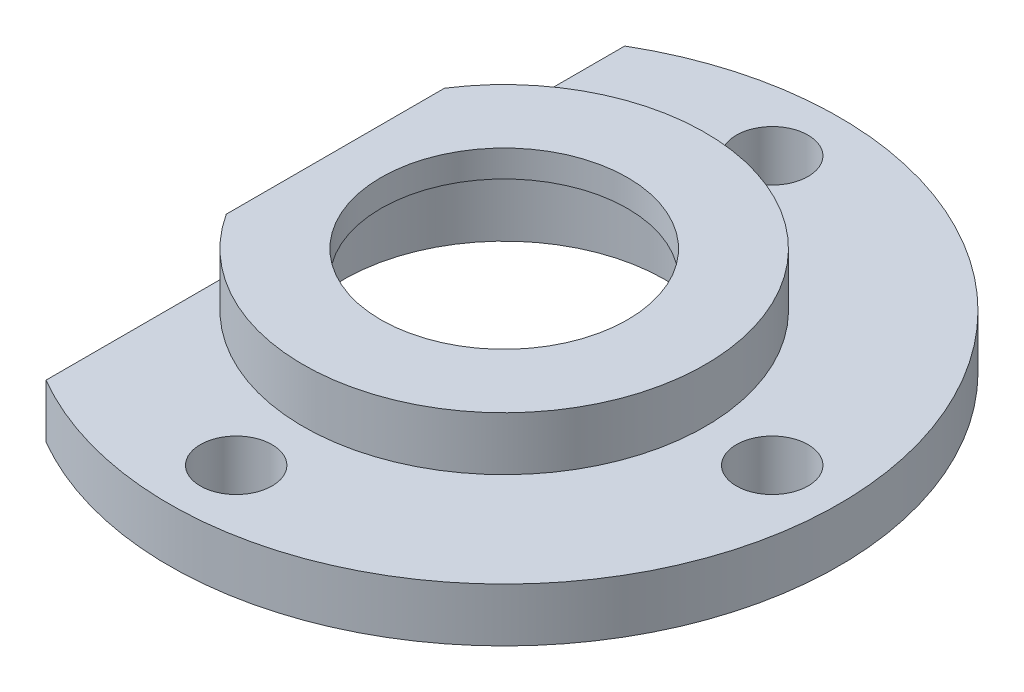
ISO-10303-21;
HEADER;
FILE_DESCRIPTION(('STEP AP214'),'2;1');
FILE_NAME('part.step','',(''),(''),'','','');
FILE_SCHEMA(('AUTOMOTIVE_DESIGN { 1 0 10303 214 1 1 1 1 }'));
ENDSEC;
DATA;
#1=APPLICATION_CONTEXT('core data for automotive mechanical design processes');
#2=APPLICATION_PROTOCOL_DEFINITION('international standard','automotive_design',2000,#1);
#3=PRODUCT_CONTEXT('',#1,'mechanical');
#4=PRODUCT('Part','Part','',(#3));
#5=PRODUCT_RELATED_PRODUCT_CATEGORY('part','',(#4));
#6=PRODUCT_DEFINITION_FORMATION('','',#4);
#7=PRODUCT_DEFINITION_CONTEXT('part definition',#1,'design');
#8=PRODUCT_DEFINITION('design','',#6,#7);
#9=PRODUCT_DEFINITION_SHAPE('','',#8);
#10=(LENGTH_UNIT() NAMED_UNIT(*) SI_UNIT(.MILLI.,.METRE.));
#11=(NAMED_UNIT(*) PLANE_ANGLE_UNIT() SI_UNIT($,.RADIAN.));
#12=(NAMED_UNIT(*) SI_UNIT($,.STERADIAN.) SOLID_ANGLE_UNIT());
#13=UNCERTAINTY_MEASURE_WITH_UNIT(LENGTH_MEASURE(1.E-05),#10,'distance_accuracy_value','');
#14=(GEOMETRIC_REPRESENTATION_CONTEXT(3) GLOBAL_UNCERTAINTY_ASSIGNED_CONTEXT((#13)) GLOBAL_UNIT_ASSIGNED_CONTEXT((#10,
#11,#12)) REPRESENTATION_CONTEXT('',''));
#15=CARTESIAN_POINT('',(0.,0.,0.));
#16=DIRECTION('',(0.,0.,1.));
#17=DIRECTION('',(1.,0.,0.));
#18=AXIS2_PLACEMENT_3D('',#15,#16,#17);
#19=CARTESIAN_POINT('',(0.,2.54,0.));
#20=DIRECTION('',(0.,-1.,0.));
#21=DIRECTION('',(0.,0.,-1.));
#22=AXIS2_PLACEMENT_3D('',#19,#20,#21);
#23=CYLINDRICAL_SURFACE('',#22,15.875);
#24=DIRECTION('',(0.,-1.,0.));
#25=VECTOR('',#24,1.);
#26=CARTESIAN_POINT('',(-8.,5.33400000000001,-13.7118789740867));
#27=LINE('',#26,#25);
#28=CARTESIAN_POINT('',(-8.,2.54,-13.7118789740867));
#29=VERTEX_POINT('',#28);
#30=CARTESIAN_POINT('',(-8.,0.,-13.7118789740867));
#31=VERTEX_POINT('',#30);
#32=EDGE_CURVE('E80',#29,#31,#27,.T.);
#33=ORIENTED_EDGE('',*,*,#32,.F.);
#34=CARTESIAN_POINT('',(0.,2.54,0.));
#35=DIRECTION('',(0.,1.,0.));
#36=DIRECTION('',(0.,0.,1.));
#37=AXIS2_PLACEMENT_3D('',#34,#35,#36);
#38=CIRCLE('',#37,15.875);
#39=CARTESIAN_POINT('',(-8.,2.54,13.7118789740867));
#40=VERTEX_POINT('',#39);
#41=EDGE_CURVE('E100',#40,#29,#38,.T.);
#42=ORIENTED_EDGE('',*,*,#41,.F.);
#43=DIRECTION('',(0.,-1.,0.));
#44=VECTOR('',#43,1.);
#45=CARTESIAN_POINT('',(-8.,5.33400000000001,13.7118789740867));
#46=LINE('',#45,#44);
#47=CARTESIAN_POINT('',(-8.,0.,13.7118789740867));
#48=VERTEX_POINT('',#47);
#49=EDGE_CURVE('E91',#40,#48,#46,.T.);
#50=ORIENTED_EDGE('',*,*,#49,.T.);
#51=CARTESIAN_POINT('',(0.,0.,0.));
#52=DIRECTION('',(0.,1.,0.));
#53=DIRECTION('',(0.,0.,1.));
#54=AXIS2_PLACEMENT_3D('',#51,#52,#53);
#55=CIRCLE('',#54,15.875);
#56=EDGE_CURVE('E96',#48,#31,#55,.T.);
#57=ORIENTED_EDGE('',*,*,#56,.T.);
#58=EDGE_LOOP('',(#33,#42,#50,#57));
#59=FACE_BOUND('',#58,.T.);
#60=ADVANCED_FACE('F43',(#59),#23,.T.);
#61=CARTESIAN_POINT('',(0.,2.54,0.));
#62=DIRECTION('',(0.,1.,0.));
#63=DIRECTION('',(0.,0.,1.));
#64=AXIS2_PLACEMENT_3D('',#61,#62,#63);
#65=PLANE('',#64);
#66=CARTESIAN_POINT('',(0.,2.54,12.7));
#67=DIRECTION('',(0.,1.,0.));
#68=DIRECTION('',(0.,0.,1.));
#69=AXIS2_PLACEMENT_3D('',#66,#67,#68);
#70=CIRCLE('',#69,1.7);
#71=CARTESIAN_POINT('',(0.,2.54,14.4));
#72=VERTEX_POINT('',#71);
#73=EDGE_CURVE('E128',#72,#72,#70,.T.);
#74=ORIENTED_EDGE('',*,*,#73,.F.);
#75=EDGE_LOOP('',(#74));
#76=FACE_BOUND('',#75,.T.);
#77=CARTESIAN_POINT('',(12.7,2.54,0.));
#78=DIRECTION('',(0.,1.,0.));
#79=DIRECTION('',(0.,0.,1.));
#80=AXIS2_PLACEMENT_3D('',#77,#78,#79);
#81=CIRCLE('',#80,1.70000000000004);
#82=CARTESIAN_POINT('',(12.7,2.54,1.70000000000004));
#83=VERTEX_POINT('',#82);
#84=EDGE_CURVE('E137',#83,#83,#81,.T.);
#85=ORIENTED_EDGE('',*,*,#84,.F.);
#86=EDGE_LOOP('',(#85));
#87=FACE_BOUND('',#86,.T.);
#88=CARTESIAN_POINT('',(0.,2.54,-12.7));
#89=DIRECTION('',(0.,1.,0.));
#90=DIRECTION('',(0.,0.,1.));
#91=AXIS2_PLACEMENT_3D('',#88,#89,#90);
#92=CIRCLE('',#91,1.7);
#93=CARTESIAN_POINT('',(0.,2.54,-11.));
#94=VERTEX_POINT('',#93);
#95=EDGE_CURVE('E141',#94,#94,#92,.T.);
#96=ORIENTED_EDGE('',*,*,#95,.F.);
#97=EDGE_LOOP('',(#96));
#98=FACE_BOUND('',#97,.T.);
#99=ORIENTED_EDGE('',*,*,#41,.T.);
#100=DIRECTION('',(0.,0.,1.));
#101=VECTOR('',#100,1.);
#102=CARTESIAN_POINT('',(-8.,2.54,0.));
#103=LINE('',#102,#101);
#104=CARTESIAN_POINT('',(-8.,2.54,-5.16968325915621));
#105=VERTEX_POINT('',#104);
#106=EDGE_CURVE('E85',#29,#105,#103,.T.);
#107=ORIENTED_EDGE('',*,*,#106,.T.);
#108=CARTESIAN_POINT('',(0.,2.54,0.));
#109=DIRECTION('',(0.,1.,0.));
#110=DIRECTION('',(0.,0.,1.));
#111=AXIS2_PLACEMENT_3D('',#108,#109,#110);
#112=CIRCLE('',#111,9.525);
#113=CARTESIAN_POINT('',(-8.,2.54,5.16968325915621));
#114=VERTEX_POINT('',#113);
#115=EDGE_CURVE('E51',#114,#105,#112,.T.);
#116=ORIENTED_EDGE('',*,*,#115,.F.);
#117=EDGE_CURVE('E151',#114,#40,#103,.T.);
#118=ORIENTED_EDGE('',*,*,#117,.T.);
#119=EDGE_LOOP('',(#99,#107,#116,#118));
#120=FACE_BOUND('',#119,.T.);
#121=ADVANCED_FACE('F163',(#76,#87,#98,#120),#65,.T.);
#122=CARTESIAN_POINT('',(0.,0.,0.));
#123=DIRECTION('',(0.,1.,0.));
#124=DIRECTION('',(0.,0.,1.));
#125=AXIS2_PLACEMENT_3D('',#122,#123,#124);
#126=PLANE('',#125);
#127=CARTESIAN_POINT('',(0.,0.,0.));
#128=DIRECTION('',(0.,-1.,0.));
#129=DIRECTION('',(0.,0.,-1.));
#130=AXIS2_PLACEMENT_3D('',#127,#128,#129);
#131=CIRCLE('',#130,7.62);
#132=CARTESIAN_POINT('',(0.,0.,-7.62));
#133=VERTEX_POINT('',#132);
#134=EDGE_CURVE('E112',#133,#133,#131,.T.);
#135=ORIENTED_EDGE('',*,*,#134,.F.);
#136=EDGE_LOOP('',(#135));
#137=FACE_BOUND('',#136,.T.);
#138=CARTESIAN_POINT('',(0.,0.,12.7));
#139=DIRECTION('',(0.,1.,0.));
#140=DIRECTION('',(0.,0.,1.));
#141=AXIS2_PLACEMENT_3D('',#138,#139,#140);
#142=CIRCLE('',#141,1.7);
#143=CARTESIAN_POINT('',(0.,0.,14.4));
#144=VERTEX_POINT('',#143);
#145=EDGE_CURVE('E133',#144,#144,#142,.F.);
#146=ORIENTED_EDGE('',*,*,#145,.F.);
#147=EDGE_LOOP('',(#146));
#148=FACE_BOUND('',#147,.T.);
#149=CARTESIAN_POINT('',(12.7,0.,0.));
#150=DIRECTION('',(0.,1.,0.));
#151=DIRECTION('',(0.,0.,1.));
#152=AXIS2_PLACEMENT_3D('',#149,#150,#151);
#153=CIRCLE('',#152,1.70000000000004);
#154=CARTESIAN_POINT('',(12.7,0.,1.70000000000004));
#155=VERTEX_POINT('',#154);
#156=EDGE_CURVE('E132',#155,#155,#153,.F.);
#157=ORIENTED_EDGE('',*,*,#156,.F.);
#158=EDGE_LOOP('',(#157));
#159=FACE_BOUND('',#158,.T.);
#160=CARTESIAN_POINT('',(0.,0.,-12.7));
#161=DIRECTION('',(0.,1.,0.));
#162=DIRECTION('',(0.,0.,1.));
#163=AXIS2_PLACEMENT_3D('',#160,#161,#162);
#164=CIRCLE('',#163,1.7);
#165=CARTESIAN_POINT('',(0.,0.,-11.));
#166=VERTEX_POINT('',#165);
#167=EDGE_CURVE('E124',#166,#166,#164,.F.);
#168=ORIENTED_EDGE('',*,*,#167,.F.);
#169=EDGE_LOOP('',(#168));
#170=FACE_BOUND('',#169,.T.);
#171=DIRECTION('',(0.,0.,1.));
#172=VECTOR('',#171,1.);
#173=CARTESIAN_POINT('',(-8.,0.,0.));
#174=LINE('',#173,#172);
#175=EDGE_CURVE('E83',#31,#48,#174,.T.);
#176=ORIENTED_EDGE('',*,*,#175,.F.);
#177=ORIENTED_EDGE('',*,*,#56,.F.);
#178=EDGE_LOOP('',(#176,#177));
#179=FACE_BOUND('',#178,.T.);
#180=ADVANCED_FACE('F95',(#137,#148,#159,#170,#179),#126,.F.);
#181=CARTESIAN_POINT('',(0.,5.08,0.));
#182=DIRECTION('',(0.,-1.,0.));
#183=DIRECTION('',(0.,0.,-1.));
#184=AXIS2_PLACEMENT_3D('',#181,#182,#183);
#185=CYLINDRICAL_SURFACE('',#184,9.525);
#186=DIRECTION('',(0.,-1.,0.));
#187=VECTOR('',#186,1.);
#188=CARTESIAN_POINT('',(-8.,5.08,-5.16968325915621));
#189=LINE('',#188,#187);
#190=CARTESIAN_POINT('',(-8.,5.08,-5.16968325915621));
#191=VERTEX_POINT('',#190);
#192=EDGE_CURVE('E63',#191,#105,#189,.T.);
#193=ORIENTED_EDGE('',*,*,#192,.F.);
#194=CARTESIAN_POINT('',(0.,5.08,0.));
#195=DIRECTION('',(0.,1.,0.));
#196=DIRECTION('',(0.,0.,1.));
#197=AXIS2_PLACEMENT_3D('',#194,#195,#196);
#198=CIRCLE('',#197,9.525);
#199=CARTESIAN_POINT('',(-8.,5.08,5.16968325915621));
#200=VERTEX_POINT('',#199);
#201=EDGE_CURVE('E101',#200,#191,#198,.T.);
#202=ORIENTED_EDGE('',*,*,#201,.F.);
#203=DIRECTION('',(0.,-1.,0.));
#204=VECTOR('',#203,1.);
#205=CARTESIAN_POINT('',(-8.,5.08,5.16968325915621));
#206=LINE('',#205,#204);
#207=EDGE_CURVE('E58',#114,#200,#206,.F.);
#208=ORIENTED_EDGE('',*,*,#207,.F.);
#209=ORIENTED_EDGE('',*,*,#115,.T.);
#210=EDGE_LOOP('',(#193,#202,#208,#209));
#211=FACE_BOUND('',#210,.T.);
#212=ADVANCED_FACE('F165',(#211),#185,.T.);
#213=CARTESIAN_POINT('',(0.,5.08,0.));
#214=DIRECTION('',(0.,1.,0.));
#215=DIRECTION('',(0.,0.,1.));
#216=AXIS2_PLACEMENT_3D('',#213,#214,#215);
#217=PLANE('',#216);
#218=CARTESIAN_POINT('',(0.,5.08,0.));
#219=DIRECTION('',(0.,1.,0.));
#220=DIRECTION('',(0.,0.,1.));
#221=AXIS2_PLACEMENT_3D('',#218,#219,#220);
#222=CIRCLE('',#221,5.842);
#223=CARTESIAN_POINT('',(0.,5.08,5.842));
#224=VERTEX_POINT('',#223);
#225=EDGE_CURVE('E116',#224,#224,#222,.T.);
#226=ORIENTED_EDGE('',*,*,#225,.F.);
#227=EDGE_LOOP('',(#226));
#228=FACE_BOUND('',#227,.T.);
#229=ORIENTED_EDGE('',*,*,#201,.T.);
#230=DIRECTION('',(0.,0.,1.));
#231=VECTOR('',#230,1.);
#232=CARTESIAN_POINT('',(-8.,5.08,0.));
#233=LINE('',#232,#231);
#234=EDGE_CURVE('E11',#191,#200,#233,.T.);
#235=ORIENTED_EDGE('',*,*,#234,.T.);
#236=EDGE_LOOP('',(#229,#235));
#237=FACE_BOUND('',#236,.T.);
#238=ADVANCED_FACE('F168',(#228,#237),#217,.T.);
#239=CARTESIAN_POINT('',(0.,3.81,0.));
#240=DIRECTION('',(0.,-1.,0.));
#241=DIRECTION('',(0.,0.,-1.));
#242=AXIS2_PLACEMENT_3D('',#239,#240,#241);
#243=CYLINDRICAL_SURFACE('',#242,7.62);
#244=CARTESIAN_POINT('',(0.,3.81,0.));
#245=DIRECTION('',(0.,-1.,0.));
#246=DIRECTION('',(0.,0.,-1.));
#247=AXIS2_PLACEMENT_3D('',#244,#245,#246);
#248=CIRCLE('',#247,7.62);
#249=CARTESIAN_POINT('',(0.,3.81,-7.62));
#250=VERTEX_POINT('',#249);
#251=EDGE_CURVE('E106',#250,#250,#248,.T.);
#252=CARTESIAN_POINT('',(0.,3.81,-7.62));
#253=CARTESIAN_POINT('',(0.,3.7703125,-7.62));
#254=CARTESIAN_POINT('',(0.,3.730625,-7.62));
#255=CARTESIAN_POINT('',(0.,3.65125,-7.62));
#256=CARTESIAN_POINT('',(0.,3.6115625,-7.62));
#257=CARTESIAN_POINT('',(0.,3.5321875,-7.62));
#258=CARTESIAN_POINT('',(0.,3.4925,-7.62));
#259=CARTESIAN_POINT('',(0.,3.413125,-7.62));
#260=CARTESIAN_POINT('',(0.,3.3734375,-7.62));
#261=CARTESIAN_POINT('',(0.,3.2940625,-7.62));
#262=CARTESIAN_POINT('',(0.,3.254375,-7.62));
#263=CARTESIAN_POINT('',(0.,3.175,-7.62));
#264=CARTESIAN_POINT('',(0.,3.1353125,-7.62));
#265=CARTESIAN_POINT('',(0.,3.0559375,-7.62));
#266=CARTESIAN_POINT('',(0.,3.01625,-7.62));
#267=CARTESIAN_POINT('',(0.,2.936875,-7.62));
#268=CARTESIAN_POINT('',(0.,2.8971875,-7.62));
#269=CARTESIAN_POINT('',(0.,2.8178125,-7.62));
#270=CARTESIAN_POINT('',(0.,2.778125,-7.62));
#271=CARTESIAN_POINT('',(0.,2.69875,-7.62));
#272=CARTESIAN_POINT('',(0.,2.6590625,-7.62));
#273=CARTESIAN_POINT('',(0.,2.5796875,-7.62));
#274=CARTESIAN_POINT('',(0.,2.54,-7.62));
#275=CARTESIAN_POINT('',(0.,2.460625,-7.62));
#276=CARTESIAN_POINT('',(0.,2.4209375,-7.62));
#277=CARTESIAN_POINT('',(0.,2.3415625,-7.62));
#278=CARTESIAN_POINT('',(0.,2.301875,-7.62));
#279=CARTESIAN_POINT('',(0.,2.2225,-7.62));
#280=CARTESIAN_POINT('',(0.,2.1828125,-7.62));
#281=CARTESIAN_POINT('',(0.,2.1034375,-7.62));
#282=CARTESIAN_POINT('',(0.,2.06375,-7.62));
#283=CARTESIAN_POINT('',(0.,1.984375,-7.62));
#284=CARTESIAN_POINT('',(0.,1.9446875,-7.62));
#285=CARTESIAN_POINT('',(0.,1.8653125,-7.62));
#286=CARTESIAN_POINT('',(0.,1.825625,-7.62));
#287=CARTESIAN_POINT('',(0.,1.74625,-7.62));
#288=CARTESIAN_POINT('',(0.,1.7065625,-7.62));
#289=CARTESIAN_POINT('',(0.,1.6271875,-7.62));
#290=CARTESIAN_POINT('',(0.,1.5875,-7.62));
#291=CARTESIAN_POINT('',(0.,1.508125,-7.62));
#292=CARTESIAN_POINT('',(0.,1.4684375,-7.62));
#293=CARTESIAN_POINT('',(0.,1.3890625,-7.62));
#294=CARTESIAN_POINT('',(0.,1.349375,-7.62));
#295=CARTESIAN_POINT('',(0.,1.27,-7.62));
#296=CARTESIAN_POINT('',(0.,1.2303125,-7.62));
#297=CARTESIAN_POINT('',(0.,1.1509375,-7.62));
#298=CARTESIAN_POINT('',(0.,1.11125,-7.62));
#299=CARTESIAN_POINT('',(0.,1.031875,-7.62));
#300=CARTESIAN_POINT('',(0.,0.9921875,-7.62));
#301=CARTESIAN_POINT('',(0.,0.9128125,-7.62));
#302=CARTESIAN_POINT('',(0.,0.873125,-7.62));
#303=CARTESIAN_POINT('',(0.,0.79375,-7.62));
#304=CARTESIAN_POINT('',(0.,0.7540625,-7.62));
#305=CARTESIAN_POINT('',(0.,0.6746875,-7.62));
#306=CARTESIAN_POINT('',(0.,0.635,-7.62));
#307=CARTESIAN_POINT('',(0.,0.555625,-7.62));
#308=CARTESIAN_POINT('',(0.,0.5159375,-7.62));
#309=CARTESIAN_POINT('',(0.,0.4365625,-7.62));
#310=CARTESIAN_POINT('',(0.,0.396875,-7.62));
#311=CARTESIAN_POINT('',(0.,0.3175,-7.62));
#312=CARTESIAN_POINT('',(0.,0.2778125,-7.62));
#313=CARTESIAN_POINT('',(0.,0.1984375,-7.62));
#314=CARTESIAN_POINT('',(0.,0.15875,-7.62));
#315=CARTESIAN_POINT('',(0.,0.0793749999999999,-7.62));
#316=CARTESIAN_POINT('',(0.,0.0396874999999999,-7.62));
#317=CARTESIAN_POINT('',(0.,0.,-7.62));
#318=B_SPLINE_CURVE_WITH_KNOTS('',3,(#252,#253,#254,#255,#256,#257,#258,#259,#260,#261,#262,
#263,#264,#265,#266,#267,#268,#269,#270,#271,#272,#273,#274,#275,#276,#277,#278,#279,#280,#281,
#282,#283,#284,#285,#286,#287,#288,#289,#290,#291,#292,#293,#294,#295,#296,#297,#298,#299,#300,
#301,#302,#303,#304,#305,#306,#307,#308,#309,#310,#311,#312,#313,#314,#315,#316,#317),
.UNSPECIFIED.,.F.,.F.,(4,2,2,2,2,2,2,2,2,2,2,2,2,2,2,2,2,2,2,2,2,2,2,2,2,2,2,2,2,2,2,2,4),(0.,
0.1190625,0.238125,0.3571875,0.47625,0.5953125,0.714375,0.8334375,0.9525,1.0715625,1.190625,
1.3096875,1.42875,1.5478125,1.666875,1.7859375,1.905,2.0240625,2.143125,2.2621875,2.38125,
2.5003125,2.619375,2.7384375,2.8575,2.9765625,3.095625,3.2146875,3.33375,3.4528125,3.571875,
3.6909375,3.81),.UNSPECIFIED.);
#319=EDGE_CURVE('BSEAM170',#250,#133,#318,.T.);
#320=ORIENTED_EDGE('',*,*,#251,.F.);
#321=ORIENTED_EDGE('',*,*,#134,.T.);
#322=ORIENTED_EDGE('',*,*,#319,.T.);
#323=ORIENTED_EDGE('',*,*,#319,.F.);
#324=EDGE_LOOP('',(#320,#322,#321,#323));
#325=FACE_BOUND('',#324,.T.);
#326=ADVANCED_FACE('F170',(#325),#243,.F.);
#327=CARTESIAN_POINT('',(0.,3.81,0.));
#328=DIRECTION('',(0.,-1.,0.));
#329=DIRECTION('',(0.,0.,-1.));
#330=AXIS2_PLACEMENT_3D('',#327,#328,#329);
#331=PLANE('',#330);
#332=CARTESIAN_POINT('',(0.,3.81,0.));
#333=DIRECTION('',(0.,-1.,0.));
#334=DIRECTION('',(0.,0.,-1.));
#335=AXIS2_PLACEMENT_3D('',#332,#333,#334);
#336=CIRCLE('',#335,5.842);
#337=CARTESIAN_POINT('',(0.,3.81,-5.842));
#338=VERTEX_POINT('',#337);
#339=EDGE_CURVE('E120',#338,#338,#336,.F.);
#340=ORIENTED_EDGE('',*,*,#339,.T.);
#341=EDGE_LOOP('',(#340));
#342=FACE_BOUND('',#341,.T.);
#343=ORIENTED_EDGE('',*,*,#251,.T.);
#344=EDGE_LOOP('',(#343));
#345=FACE_BOUND('',#344,.T.);
#346=ADVANCED_FACE('F177',(#342,#345),#331,.T.);
#347=CARTESIAN_POINT('',(0.,-0.00100000000000013,0.));
#348=DIRECTION('',(0.,1.,0.));
#349=DIRECTION('',(0.,0.,1.));
#350=AXIS2_PLACEMENT_3D('',#347,#348,#349);
#351=CYLINDRICAL_SURFACE('',#350,5.842);
#352=ORIENTED_EDGE('',*,*,#339,.F.);
#353=EDGE_LOOP('',(#352));
#354=FACE_BOUND('',#353,.T.);
#355=ORIENTED_EDGE('',*,*,#225,.T.);
#356=EDGE_LOOP('',(#355));
#357=FACE_BOUND('',#356,.T.);
#358=ADVANCED_FACE('F216',(#354,#357),#351,.F.);
#359=CARTESIAN_POINT('',(0.,-0.00100000000000013,12.7));
#360=DIRECTION('',(0.,1.,0.));
#361=DIRECTION('',(0.,0.,1.));
#362=AXIS2_PLACEMENT_3D('',#359,#360,#361);
#363=CYLINDRICAL_SURFACE('',#362,1.7);
#364=ORIENTED_EDGE('',*,*,#73,.T.);
#365=EDGE_LOOP('',(#364));
#366=FACE_BOUND('',#365,.T.);
#367=ORIENTED_EDGE('',*,*,#145,.T.);
#368=EDGE_LOOP('',(#367));
#369=FACE_BOUND('',#368,.T.);
#370=ADVANCED_FACE('F210',(#366,#369),#363,.F.);
#371=CARTESIAN_POINT('',(12.7,-0.00100000000000013,0.));
#372=DIRECTION('',(0.,1.,0.));
#373=DIRECTION('',(0.,0.,1.));
#374=AXIS2_PLACEMENT_3D('',#371,#372,#373);
#375=CYLINDRICAL_SURFACE('',#374,1.70000000000004);
#376=ORIENTED_EDGE('',*,*,#84,.T.);
#377=EDGE_LOOP('',(#376));
#378=FACE_BOUND('',#377,.T.);
#379=ORIENTED_EDGE('',*,*,#156,.T.);
#380=EDGE_LOOP('',(#379));
#381=FACE_BOUND('',#380,.T.);
#382=ADVANCED_FACE('F201',(#378,#381),#375,.F.);
#383=CARTESIAN_POINT('',(0.,-0.00100000000000013,-12.7));
#384=DIRECTION('',(0.,1.,0.));
#385=DIRECTION('',(0.,0.,1.));
#386=AXIS2_PLACEMENT_3D('',#383,#384,#385);
#387=CYLINDRICAL_SURFACE('',#386,1.7);
#388=ORIENTED_EDGE('',*,*,#95,.T.);
#389=EDGE_LOOP('',(#388));
#390=FACE_BOUND('',#389,.T.);
#391=ORIENTED_EDGE('',*,*,#167,.T.);
#392=EDGE_LOOP('',(#391));
#393=FACE_BOUND('',#392,.T.);
#394=ADVANCED_FACE('F198',(#390,#393),#387,.F.);
#395=CARTESIAN_POINT('',(-8.,5.33400000000001,0.));
#396=DIRECTION('',(-1.,0.,0.));
#397=DIRECTION('',(0.,0.,1.));
#398=AXIS2_PLACEMENT_3D('',#395,#396,#397);
#399=PLANE('',#398);
#400=ORIENTED_EDGE('',*,*,#32,.T.);
#401=ORIENTED_EDGE('',*,*,#175,.T.);
#402=ORIENTED_EDGE('',*,*,#49,.F.);
#403=ORIENTED_EDGE('',*,*,#117,.F.);
#404=ORIENTED_EDGE('',*,*,#207,.T.);
#405=ORIENTED_EDGE('',*,*,#234,.F.);
#406=ORIENTED_EDGE('',*,*,#192,.T.);
#407=ORIENTED_EDGE('',*,*,#106,.F.);
#408=EDGE_LOOP('',(#400,#401,#402,#403,#404,#405,#406,#407));
#409=FACE_BOUND('',#408,.T.);
#410=ADVANCED_FACE('F82',(#409),#399,.T.);
#411=CLOSED_SHELL('',(#60,#121,#180,#212,#238,#326,#346,#358,#370,#382,#394,#410));
#412=MANIFOLD_SOLID_BREP('B2',#411);
#413=ADVANCED_BREP_SHAPE_REPRESENTATION('',(#18,#412),#14);
#414=SHAPE_DEFINITION_REPRESENTATION(#9,#413);
ENDSEC;
END-ISO-10303-21;
